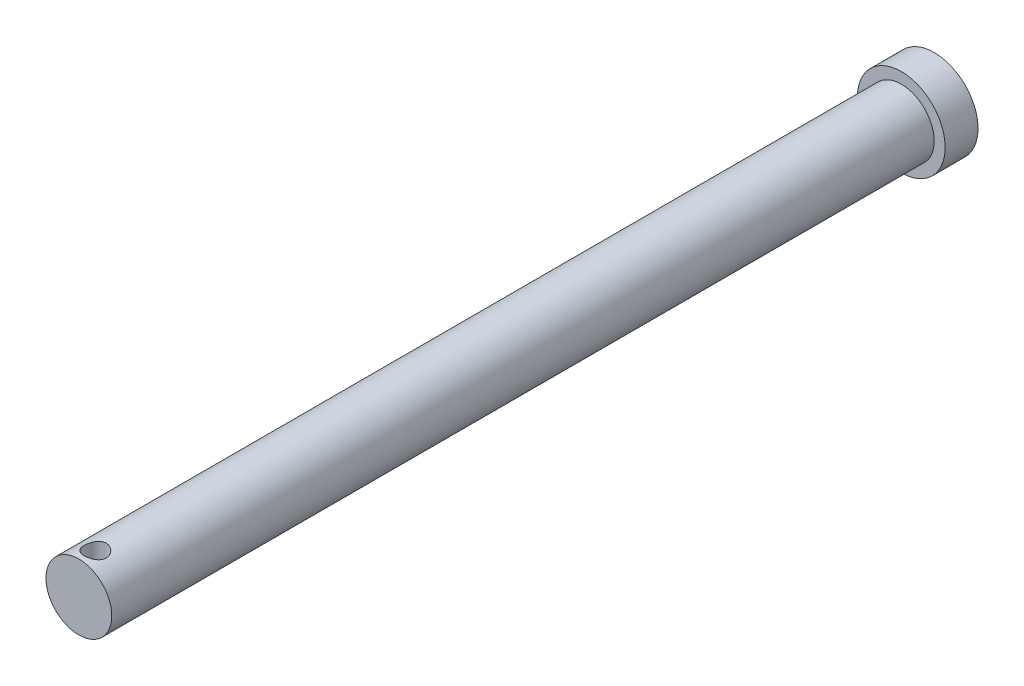
ISO-10303-21;
HEADER;
FILE_DESCRIPTION(('STEP AP214'),'2;1');
FILE_NAME('part.step','',(''),(''),'','','');
FILE_SCHEMA(('AUTOMOTIVE_DESIGN { 1 0 10303 214 1 1 1 1 }'));
ENDSEC;
DATA;
#1=APPLICATION_CONTEXT('core data for automotive mechanical design processes');
#2=APPLICATION_PROTOCOL_DEFINITION('international standard','automotive_design',2000,#1);
#3=PRODUCT_CONTEXT('',#1,'mechanical');
#4=PRODUCT('Part','Part','',(#3));
#5=PRODUCT_RELATED_PRODUCT_CATEGORY('part','',(#4));
#6=PRODUCT_DEFINITION_FORMATION('','',#4);
#7=PRODUCT_DEFINITION_CONTEXT('part definition',#1,'design');
#8=PRODUCT_DEFINITION('design','',#6,#7);
#9=PRODUCT_DEFINITION_SHAPE('','',#8);
#10=(LENGTH_UNIT() NAMED_UNIT(*) SI_UNIT(.MILLI.,.METRE.));
#11=(NAMED_UNIT(*) PLANE_ANGLE_UNIT() SI_UNIT($,.RADIAN.));
#12=(NAMED_UNIT(*) SI_UNIT($,.STERADIAN.) SOLID_ANGLE_UNIT());
#13=UNCERTAINTY_MEASURE_WITH_UNIT(LENGTH_MEASURE(1.E-05),#10,'distance_accuracy_value','');
#14=(GEOMETRIC_REPRESENTATION_CONTEXT(3) GLOBAL_UNCERTAINTY_ASSIGNED_CONTEXT((#13)) GLOBAL_UNIT_ASSIGNED_CONTEXT((#10,
#11,#12)) REPRESENTATION_CONTEXT('',''));
#15=CARTESIAN_POINT('',(0.,0.,0.));
#16=DIRECTION('',(0.,0.,1.));
#17=DIRECTION('',(1.,0.,0.));
#18=AXIS2_PLACEMENT_3D('',#15,#16,#17);
#19=CARTESIAN_POINT('',(0.,0.,37.5));
#20=DIRECTION('',(0.,0.,-1.));
#21=DIRECTION('',(-1.,0.,0.));
#22=AXIS2_PLACEMENT_3D('',#19,#20,#21);
#23=CYLINDRICAL_SURFACE('',#22,3.);
#24=CARTESIAN_POINT('',(0.,-3.,37.));
#25=CARTESIAN_POINT('',(0.0545633628867237,-3.00000015300943,37.0000002537316));
#26=CARTESIAN_POINT('',(0.10912519453855,-2.99849769507545,36.9955197338728));
#27=CARTESIAN_POINT('',(0.216641760872972,-2.99265210203281,36.9777708911828));
#28=CARTESIAN_POINT('',(0.269596328118818,-2.98830867202153,36.9645016560511));
#29=CARTESIAN_POINT('',(0.372332789501776,-2.97725307906443,36.929680756616));
#30=CARTESIAN_POINT('',(0.422119825886034,-2.97054487730853,36.9081429375407));
#31=CARTESIAN_POINT('',(0.517374936805324,-2.95544445717342,36.8574588271617));
#32=CARTESIAN_POINT('',(0.562842156958705,-2.94705190667778,36.8283110349974));
#33=CARTESIAN_POINT('',(0.649741675022264,-2.92914094443005,36.7621741951412));
#34=CARTESIAN_POINT('',(0.691003700298306,-2.91959556463785,36.7249687657395));
#35=CARTESIAN_POINT('',(0.766832692702081,-2.90060314783122,36.6442328452934));
#36=CARTESIAN_POINT('',(0.801398185489461,-2.89115613290549,36.6007009650715));
#37=CARTESIAN_POINT('',(0.863824942227859,-2.87313332477274,36.5070148848035));
#38=CARTESIAN_POINT('',(0.891464858221032,-2.86459039275688,36.4567062602679));
#39=CARTESIAN_POINT('',(0.937818873877721,-2.84975305418601,36.3518239055415));
#40=CARTESIAN_POINT('',(0.956535697386765,-2.84345796160746,36.2972514828373));
#41=CARTESIAN_POINT('',(0.983873461509165,-2.83411303269377,36.1873267785033));
#42=CARTESIAN_POINT('',(0.992813448271771,-2.83096095769611,36.1320627915109));
#43=CARTESIAN_POINT('',(1.00134112333448,-2.82795656629508,36.0207362458441));
#44=CARTESIAN_POINT('',(1.00093170160472,-2.8281032302273,35.9646739392908));
#45=CARTESIAN_POINT('',(0.99101990370342,-2.8315901500818,35.856063369556));
#46=CARTESIAN_POINT('',(0.981933913166996,-2.83478415867533,35.803471597081));
#47=CARTESIAN_POINT('',(0.95560616284942,-2.84376657724551,35.7006065803932));
#48=CARTESIAN_POINT('',(0.938363426591874,-2.84955529784108,35.6503336145649));
#49=CARTESIAN_POINT('',(0.895939058060216,-2.86317911131249,35.5525872504085));
#50=CARTESIAN_POINT('',(0.870634048707268,-2.87104565793117,35.5051719745305));
#51=CARTESIAN_POINT('',(0.812889106303144,-2.88792558575726,35.4151290917203));
#52=CARTESIAN_POINT('',(0.780447112364008,-2.89693929790464,35.3725028730666));
#53=CARTESIAN_POINT('',(0.707349332682238,-2.91567329167741,35.2909084018392));
#54=CARTESIAN_POINT('',(0.666353150076312,-2.92540589354843,35.2522473054909));
#55=CARTESIAN_POINT('',(0.578339569970066,-2.94406938387037,35.1822687333366));
#56=CARTESIAN_POINT('',(0.531321595660818,-2.95300019538067,35.1509519618355));
#57=CARTESIAN_POINT('',(0.431947613046273,-2.96917107937794,35.0963036997649));
#58=CARTESIAN_POINT('',(0.379543276416342,-2.97639350008039,35.0730545086593));
#59=CARTESIAN_POINT('',(0.271269083364512,-2.98820567144435,35.0357968260443));
#60=CARTESIAN_POINT('',(0.215400438154957,-2.99279633654879,35.0217851245766));
#61=CARTESIAN_POINT('',(0.104383829529306,-2.99867627071441,35.0039443339776));
#62=CARTESIAN_POINT('',(0.0493095998648481,-3.00010001833731,34.9997001908272));
#63=CARTESIAN_POINT('',(-0.0607750699602336,-2.99988902694825,35.0003326735985));
#64=CARTESIAN_POINT('',(-0.115785519319644,-2.99825480419352,35.0052077599799));
#65=CARTESIAN_POINT('',(-0.222519866304257,-2.99220024717114,35.023611907736));
#66=CARTESIAN_POINT('',(-0.274292806834853,-2.98786198711228,35.0368862060495));
#67=CARTESIAN_POINT('',(-0.374855958579558,-2.97691846830034,35.0713934444667));
#68=CARTESIAN_POINT('',(-0.423645788508557,-2.97031292046541,35.0926273994677));
#69=CARTESIAN_POINT('',(-0.518288296393319,-2.95528931287427,35.1430704318409));
#70=CARTESIAN_POINT('',(-0.564029959217327,-2.94682814756305,35.1724745932836));
#71=CARTESIAN_POINT('',(-0.650064830135402,-2.92905253915743,35.2381941500131));
#72=CARTESIAN_POINT('',(-0.690356367794892,-2.91973783591888,35.2745116560302));
#73=CARTESIAN_POINT('',(-0.766252507807011,-2.90076847982472,35.3549787510083));
#74=CARTESIAN_POINT('',(-0.801560969248487,-2.89111761095156,35.3994092269332));
#75=CARTESIAN_POINT('',(-0.86425752232085,-2.87299973286981,35.4937715678045));
#76=CARTESIAN_POINT('',(-0.891645547920842,-2.8645327335312,35.5437034786102));
#77=CARTESIAN_POINT('',(-0.937596930423361,-2.84982391820308,35.6476730153066));
#78=CARTESIAN_POINT('',(-0.956178132197767,-2.84357760900632,35.7017020792428));
#79=CARTESIAN_POINT('',(-0.983894666792163,-2.83410832399133,35.8123786501241));
#80=CARTESIAN_POINT('',(-0.993034254961244,-2.83088398622698,35.8690249654331));
#81=CARTESIAN_POINT('',(-1.00127628247038,-2.82797858875071,35.9801970960132));
#82=CARTESIAN_POINT('',(-1.00087025731093,-2.82812400344299,36.0346823402517));
#83=CARTESIAN_POINT('',(-0.991242293454878,-2.8315126992356,36.1427650748997));
#84=CARTESIAN_POINT('',(-0.982020879458887,-2.83475579595884,36.1963626179529));
#85=CARTESIAN_POINT('',(-0.955371813126982,-2.84384524278943,36.3001356630127));
#86=CARTESIAN_POINT('',(-0.938103346014882,-2.84964098015514,36.3503568250072));
#87=CARTESIAN_POINT('',(-0.895979365760383,-2.86316398825434,36.4472274069355));
#88=CARTESIAN_POINT('',(-0.871122168553979,-2.87089168765297,36.4938760311873));
#89=CARTESIAN_POINT('',(-0.813260692583248,-2.8878282922406,36.5844836699237));
#90=CARTESIAN_POINT('',(-0.779948242764532,-2.89708711641604,36.6282365018986));
#91=CARTESIAN_POINT('',(-0.706642883135697,-2.91583356283786,36.709689813384));
#92=CARTESIAN_POINT('',(-0.666648084451493,-2.92532124912518,36.747388575688));
#93=CARTESIAN_POINT('',(-0.579241556920672,-2.94390030525393,36.8171444122892));
#94=CARTESIAN_POINT('',(-0.531601513499724,-2.95296181801216,36.848924347751));
#95=CARTESIAN_POINT('',(-0.431357357406629,-2.96925991172652,36.9039904288506));
#96=CARTESIAN_POINT('',(-0.378754518132351,-2.9764969590794,36.927278745922));
#97=CARTESIAN_POINT('',(-0.272493647200977,-2.98805515068532,36.9637216324887));
#98=CARTESIAN_POINT('',(-0.218987757676411,-2.9924921242252,36.9772824662634));
#99=CARTESIAN_POINT('',(-0.110320416010249,-2.99846407064225,36.9954202806771));
#100=CARTESIAN_POINT('',(-0.0551594255687469,-2.99999984531906,36.9999997434965));
#101=CARTESIAN_POINT('',(0.,-3.,37.));
#102=B_SPLINE_CURVE_WITH_KNOTS('',3,(#24,#25,#26,#27,#28,#29,#30,#31,#32,#33,#34,#35,#36,#37,
#38,#39,#40,#41,#42,#43,#44,#45,#46,#47,#48,#49,#50,#51,#52,#53,#54,#55,#56,#57,#58,#59,#60,#61,
#62,#63,#64,#65,#66,#67,#68,#69,#70,#71,#72,#73,#74,#75,#76,#77,#78,#79,#80,#81,#82,#83,#84,#85,
#86,#87,#88,#89,#90,#91,#92,#93,#94,#95,#96,#97,#98,#99,#100,#101),.UNSPECIFIED.,.T.,.F.,(4,2,2,
2,2,2,2,2,2,2,2,2,2,2,2,2,2,2,2,2,2,2,2,2,2,2,2,2,2,2,2,2,2,2,2,2,2,2,4),(0.,0.163487106026011,
0.326991185267519,0.490222672870272,0.653486377799098,0.821846842827556,0.9902443328753,
1.16348384823471,1.33667044692833,1.50401925741841,1.67131633987486,1.8309682655128,
1.99063930855481,2.1528817115513,2.31517102558208,2.48593305811367,2.65671145966618,
2.82918405650357,3.00159668877208,3.1665358317517,3.33144713164176,3.49158157978214,
3.65173645284104,3.81610399843737,3.98052180821891,4.15241022880751,4.32430008234997,
4.49584013824417,4.66730284700846,4.82995666056619,4.99260079341185,5.15215587070227,
5.31174638165788,5.47830066681615,5.64490211113589,5.8179966082491,5.99104681142266,
6.15636558363623,6.3216386602795),.UNSPECIFIED.);
#103=CARTESIAN_POINT('',(0.,-3.,37.));
#104=VERTEX_POINT('',#103);
#105=EDGE_CURVE('E40',#104,#104,#102,.T.);
#106=ORIENTED_EDGE('',*,*,#105,.T.);
#107=EDGE_LOOP('',(#106));
#108=FACE_BOUND('',#107,.T.);
#109=CARTESIAN_POINT('',(0.,3.,37.));
#110=CARTESIAN_POINT('',(-0.0545633628867228,3.00000015300943,37.0000002537316));
#111=CARTESIAN_POINT('',(-0.109125194538549,2.99849769507545,36.9955197338728));
#112=CARTESIAN_POINT('',(-0.216641760872972,2.99265210203281,36.9777708911828));
#113=CARTESIAN_POINT('',(-0.269596328118817,2.98830867202153,36.9645016560511));
#114=CARTESIAN_POINT('',(-0.372332789501775,2.97725307906443,36.929680756616));
#115=CARTESIAN_POINT('',(-0.422119825886033,2.97054487730853,36.9081429375407));
#116=CARTESIAN_POINT('',(-0.517374936805323,2.95544445717342,36.8574588271617));
#117=CARTESIAN_POINT('',(-0.562842156958704,2.94705190667778,36.8283110349974));
#118=CARTESIAN_POINT('',(-0.649741675022263,2.92914094443005,36.7621741951412));
#119=CARTESIAN_POINT('',(-0.691003700298305,2.91959556463785,36.7249687657395));
#120=CARTESIAN_POINT('',(-0.766832692702081,2.90060314783122,36.6442328452934));
#121=CARTESIAN_POINT('',(-0.80139818548946,2.89115613290549,36.6007009650715));
#122=CARTESIAN_POINT('',(-0.863824942227858,2.87313332477274,36.5070148848035));
#123=CARTESIAN_POINT('',(-0.891464858221031,2.86459039275688,36.4567062602679));
#124=CARTESIAN_POINT('',(-0.93781887387772,2.84975305418601,36.3518239055415));
#125=CARTESIAN_POINT('',(-0.956535697386765,2.84345796160746,36.2972514828373));
#126=CARTESIAN_POINT('',(-0.983873461509164,2.83411303269377,36.1873267785033));
#127=CARTESIAN_POINT('',(-0.99281344827177,2.83096095769611,36.1320627915109));
#128=CARTESIAN_POINT('',(-1.00134112333448,2.82795656629508,36.0207362458441));
#129=CARTESIAN_POINT('',(-1.00093170160472,2.8281032302273,35.9646739392908));
#130=CARTESIAN_POINT('',(-0.991019903703419,2.8315901500818,35.856063369556));
#131=CARTESIAN_POINT('',(-0.981933913166996,2.83478415867533,35.803471597081));
#132=CARTESIAN_POINT('',(-0.955606162849419,2.84376657724551,35.7006065803932));
#133=CARTESIAN_POINT('',(-0.938363426591873,2.84955529784108,35.6503336145649));
#134=CARTESIAN_POINT('',(-0.895939058060215,2.86317911131249,35.5525872504085));
#135=CARTESIAN_POINT('',(-0.870634048707267,2.87104565793117,35.5051719745305));
#136=CARTESIAN_POINT('',(-0.812889106303142,2.88792558575726,35.4151290917203));
#137=CARTESIAN_POINT('',(-0.780447112364007,2.89693929790464,35.3725028730666));
#138=CARTESIAN_POINT('',(-0.707349332682237,2.91567329167741,35.2909084018392));
#139=CARTESIAN_POINT('',(-0.666353150076311,2.92540589354843,35.2522473054909));
#140=CARTESIAN_POINT('',(-0.578339569970065,2.94406938387037,35.1822687333366));
#141=CARTESIAN_POINT('',(-0.531321595660817,2.95300019538067,35.1509519618355));
#142=CARTESIAN_POINT('',(-0.431947613046272,2.96917107937794,35.0963036997649));
#143=CARTESIAN_POINT('',(-0.379543276416342,2.97639350008039,35.0730545086593));
#144=CARTESIAN_POINT('',(-0.271269083364512,2.98820567144435,35.0357968260443));
#145=CARTESIAN_POINT('',(-0.215400438154956,2.99279633654879,35.0217851245766));
#146=CARTESIAN_POINT('',(-0.104383829529305,2.99867627071441,35.0039443339776));
#147=CARTESIAN_POINT('',(-0.0493095998648473,3.00010001833731,34.9997001908272));
#148=CARTESIAN_POINT('',(0.0607750699602344,2.99988902694825,35.0003326735985));
#149=CARTESIAN_POINT('',(0.115785519319645,2.99825480419352,35.0052077599799));
#150=CARTESIAN_POINT('',(0.222519866304257,2.99220024717114,35.023611907736));
#151=CARTESIAN_POINT('',(0.274292806834854,2.98786198711228,35.0368862060495));
#152=CARTESIAN_POINT('',(0.374855958579559,2.97691846830034,35.0713934444667));
#153=CARTESIAN_POINT('',(0.423645788508558,2.97031292046541,35.0926273994677));
#154=CARTESIAN_POINT('',(0.51828829639332,2.95528931287427,35.1430704318409));
#155=CARTESIAN_POINT('',(0.564029959217328,2.94682814756305,35.1724745932836));
#156=CARTESIAN_POINT('',(0.650064830135402,2.92905253915743,35.2381941500131));
#157=CARTESIAN_POINT('',(0.690356367794893,2.91973783591888,35.2745116560302));
#158=CARTESIAN_POINT('',(0.766252507807011,2.90076847982472,35.3549787510083));
#159=CARTESIAN_POINT('',(0.801560969248488,2.89111761095156,35.3994092269332));
#160=CARTESIAN_POINT('',(0.864257522320851,2.87299973286981,35.4937715678045));
#161=CARTESIAN_POINT('',(0.891645547920843,2.8645327335312,35.5437034786102));
#162=CARTESIAN_POINT('',(0.937596930423362,2.84982391820308,35.6476730153066));
#163=CARTESIAN_POINT('',(0.956178132197767,2.84357760900632,35.7017020792428));
#164=CARTESIAN_POINT('',(0.983894666792164,2.83410832399133,35.8123786501241));
#165=CARTESIAN_POINT('',(0.993034254961245,2.83088398622698,35.8690249654331));
#166=CARTESIAN_POINT('',(1.00127628247038,2.82797858875071,35.9801970960132));
#167=CARTESIAN_POINT('',(1.00087025731093,2.82812400344299,36.0346823402517));
#168=CARTESIAN_POINT('',(0.991242293454879,2.8315126992356,36.1427650748997));
#169=CARTESIAN_POINT('',(0.982020879458888,2.83475579595884,36.1963626179529));
#170=CARTESIAN_POINT('',(0.955371813126983,2.84384524278943,36.3001356630127));
#171=CARTESIAN_POINT('',(0.938103346014883,2.84964098015514,36.3503568250072));
#172=CARTESIAN_POINT('',(0.895979365760384,2.86316398825434,36.4472274069355));
#173=CARTESIAN_POINT('',(0.87112216855398,2.87089168765297,36.4938760311873));
#174=CARTESIAN_POINT('',(0.813260692583248,2.8878282922406,36.5844836699237));
#175=CARTESIAN_POINT('',(0.779948242764532,2.89708711641604,36.6282365018986));
#176=CARTESIAN_POINT('',(0.706642883135698,2.91583356283786,36.709689813384));
#177=CARTESIAN_POINT('',(0.666648084451494,2.92532124912518,36.747388575688));
#178=CARTESIAN_POINT('',(0.579241556920673,2.94390030525393,36.8171444122892));
#179=CARTESIAN_POINT('',(0.531601513499725,2.95296181801216,36.848924347751));
#180=CARTESIAN_POINT('',(0.43135735740663,2.96925991172652,36.9039904288506));
#181=CARTESIAN_POINT('',(0.378754518132352,2.9764969590794,36.927278745922));
#182=CARTESIAN_POINT('',(0.272493647200978,2.98805515068532,36.9637216324887));
#183=CARTESIAN_POINT('',(0.218987757676412,2.9924921242252,36.9772824662634));
#184=CARTESIAN_POINT('',(0.110320416010249,2.99846407064225,36.9954202806771));
#185=CARTESIAN_POINT('',(0.0551594255687477,2.99999984531906,36.9999997434965));
#186=CARTESIAN_POINT('',(0.,3.,37.));
#187=B_SPLINE_CURVE_WITH_KNOTS('',3,(#109,#110,#111,#112,#113,#114,#115,#116,#117,#118,#119,
#120,#121,#122,#123,#124,#125,#126,#127,#128,#129,#130,#131,#132,#133,#134,#135,#136,#137,#138,
#139,#140,#141,#142,#143,#144,#145,#146,#147,#148,#149,#150,#151,#152,#153,#154,#155,#156,#157,
#158,#159,#160,#161,#162,#163,#164,#165,#166,#167,#168,#169,#170,#171,#172,#173,#174,#175,#176,
#177,#178,#179,#180,#181,#182,#183,#184,#185,#186),.UNSPECIFIED.,.T.,.F.,(4,2,2,2,2,2,2,2,2,2,2,
2,2,2,2,2,2,2,2,2,2,2,2,2,2,2,2,2,2,2,2,2,2,2,2,2,2,2,4),(0.,0.163487106026011,
0.326991185267519,0.490222672870272,0.653486377799098,0.821846842827556,0.9902443328753,
1.16348384823471,1.33667044692833,1.50401925741841,1.67131633987486,1.8309682655128,
1.99063930855481,2.1528817115513,2.31517102558208,2.48593305811367,2.65671145966618,
2.82918405650357,3.00159668877208,3.1665358317517,3.33144713164176,3.49158157978214,
3.65173645284104,3.81610399843737,3.98052180821891,4.15241022880751,4.32430008234997,
4.49584013824417,4.66730284700846,4.82995666056619,4.99260079341185,5.15215587070227,
5.31174638165788,5.47830066681615,5.64490211113589,5.8179966082491,5.99104681142266,
6.15636558363623,6.3216386602795),.UNSPECIFIED.);
#188=CARTESIAN_POINT('',(0.,3.,37.));
#189=VERTEX_POINT('',#188);
#190=EDGE_CURVE('E60',#189,#189,#187,.T.);
#191=ORIENTED_EDGE('',*,*,#190,.T.);
#192=EDGE_LOOP('',(#191));
#193=FACE_BOUND('',#192,.T.);
#194=CARTESIAN_POINT('',(0.,0.,37.5));
#195=DIRECTION('',(0.,0.,1.));
#196=DIRECTION('',(1.,0.,0.));
#197=AXIS2_PLACEMENT_3D('',#194,#195,#196);
#198=CIRCLE('',#197,3.);
#199=CARTESIAN_POINT('',(3.,0.,37.5));
#200=VERTEX_POINT('',#199);
#201=EDGE_CURVE('E10',#200,#200,#198,.T.);
#202=ORIENTED_EDGE('',*,*,#201,.F.);
#203=EDGE_LOOP('',(#202));
#204=FACE_BOUND('',#203,.T.);
#205=CARTESIAN_POINT('',(0.,0.,-37.5));
#206=DIRECTION('',(0.,0.,1.));
#207=DIRECTION('',(1.,0.,0.));
#208=AXIS2_PLACEMENT_3D('',#205,#206,#207);
#209=CIRCLE('',#208,3.);
#210=CARTESIAN_POINT('',(3.,0.,-37.5));
#211=VERTEX_POINT('',#210);
#212=EDGE_CURVE('E49',#211,#211,#209,.T.);
#213=ORIENTED_EDGE('',*,*,#212,.T.);
#214=EDGE_LOOP('',(#213));
#215=FACE_BOUND('',#214,.T.);
#216=ADVANCED_FACE('F36',(#108,#193,#204,#215),#23,.T.);
#217=CARTESIAN_POINT('',(0.,0.,37.5));
#218=DIRECTION('',(0.,0.,1.));
#219=DIRECTION('',(1.,0.,0.));
#220=AXIS2_PLACEMENT_3D('',#217,#218,#219);
#221=PLANE('',#220);
#222=ORIENTED_EDGE('',*,*,#201,.T.);
#223=EDGE_LOOP('',(#222));
#224=FACE_BOUND('',#223,.T.);
#225=ADVANCED_FACE('F82',(#224),#221,.T.);
#226=CARTESIAN_POINT('',(0.,0.,-40.5));
#227=DIRECTION('',(0.,0.,1.));
#228=DIRECTION('',(1.,0.,0.));
#229=AXIS2_PLACEMENT_3D('',#226,#227,#228);
#230=CYLINDRICAL_SURFACE('',#229,4.);
#231=CARTESIAN_POINT('',(0.,0.,-40.5));
#232=DIRECTION('',(0.,0.,-1.));
#233=DIRECTION('',(-1.,0.,0.));
#234=AXIS2_PLACEMENT_3D('',#231,#232,#233);
#235=CIRCLE('',#234,4.);
#236=CARTESIAN_POINT('',(-4.,0.,-40.5));
#237=VERTEX_POINT('',#236);
#238=EDGE_CURVE('E55',#237,#237,#235,.T.);
#239=ORIENTED_EDGE('',*,*,#238,.F.);
#240=EDGE_LOOP('',(#239));
#241=FACE_BOUND('',#240,.T.);
#242=CARTESIAN_POINT('',(0.,0.,-37.5));
#243=DIRECTION('',(0.,0.,-1.));
#244=DIRECTION('',(-1.,0.,0.));
#245=AXIS2_PLACEMENT_3D('',#242,#243,#244);
#246=CIRCLE('',#245,4.);
#247=CARTESIAN_POINT('',(-4.,0.,-37.5));
#248=VERTEX_POINT('',#247);
#249=EDGE_CURVE('E58',#248,#248,#246,.T.);
#250=ORIENTED_EDGE('',*,*,#249,.T.);
#251=EDGE_LOOP('',(#250));
#252=FACE_BOUND('',#251,.T.);
#253=ADVANCED_FACE('F76',(#241,#252),#230,.T.);
#254=CARTESIAN_POINT('',(0.,0.,-40.5));
#255=DIRECTION('',(0.,0.,-1.));
#256=DIRECTION('',(-1.,0.,0.));
#257=AXIS2_PLACEMENT_3D('',#254,#255,#256);
#258=PLANE('',#257);
#259=ORIENTED_EDGE('',*,*,#238,.T.);
#260=EDGE_LOOP('',(#259));
#261=FACE_BOUND('',#260,.T.);
#262=ADVANCED_FACE('F72',(#261),#258,.T.);
#263=CARTESIAN_POINT('',(0.,0.,-37.5));
#264=DIRECTION('',(0.,0.,-1.));
#265=DIRECTION('',(-1.,0.,0.));
#266=AXIS2_PLACEMENT_3D('',#263,#264,#265);
#267=PLANE('',#266);
#268=ORIENTED_EDGE('',*,*,#212,.F.);
#269=EDGE_LOOP('',(#268));
#270=FACE_BOUND('',#269,.T.);
#271=ORIENTED_EDGE('',*,*,#249,.F.);
#272=EDGE_LOOP('',(#271));
#273=FACE_BOUND('',#272,.T.);
#274=ADVANCED_FACE('F70',(#270,#273),#267,.F.);
#275=CARTESIAN_POINT('',(0.,-4.,36.));
#276=DIRECTION('',(0.,1.,0.));
#277=DIRECTION('',(0.,0.,1.));
#278=AXIS2_PLACEMENT_3D('',#275,#276,#277);
#279=CYLINDRICAL_SURFACE('',#278,1.);
#280=ORIENTED_EDGE('',*,*,#190,.F.);
#281=EDGE_LOOP('',(#280));
#282=FACE_BOUND('',#281,.T.);
#283=ORIENTED_EDGE('',*,*,#105,.F.);
#284=EDGE_LOOP('',(#283));
#285=FACE_BOUND('',#284,.T.);
#286=ADVANCED_FACE('F66',(#282,#285),#279,.F.);
#287=CLOSED_SHELL('',(#216,#225,#253,#262,#274,#286));
#288=MANIFOLD_SOLID_BREP('B2',#287);
#289=ADVANCED_BREP_SHAPE_REPRESENTATION('',(#18,#288),#14);
#290=SHAPE_DEFINITION_REPRESENTATION(#9,#289);
ENDSEC;
END-ISO-10303-21;
